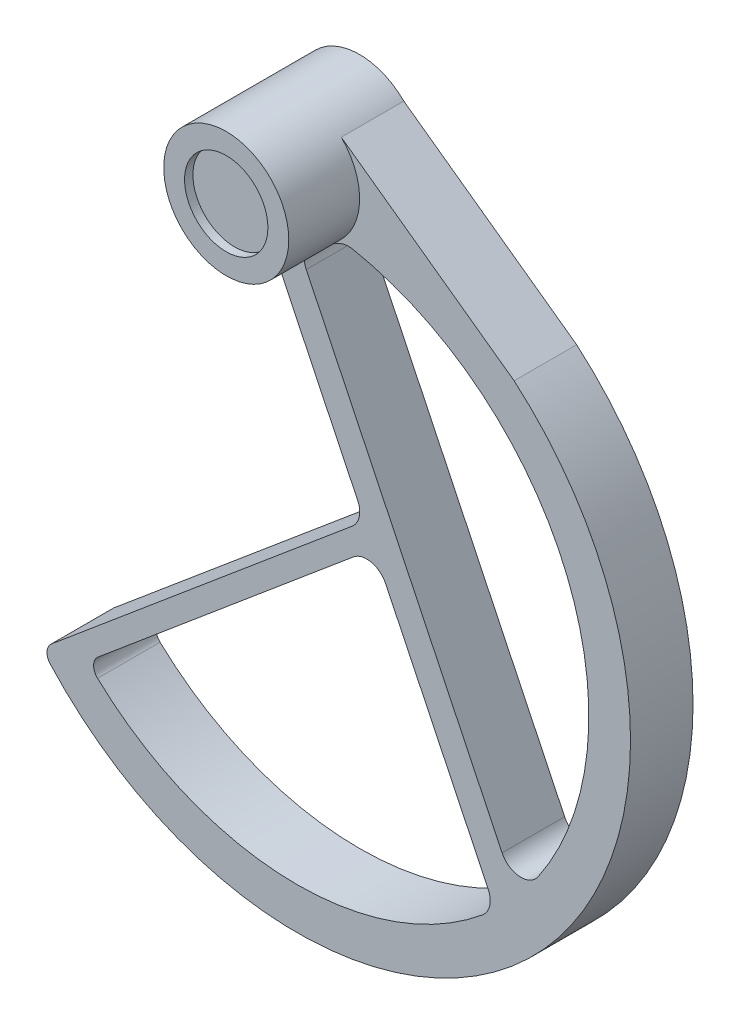
ISO-10303-21;
HEADER;
FILE_DESCRIPTION(('STEP AP214'),'2;1');
FILE_NAME('part.step','',(''),(''),'','','');
FILE_SCHEMA(('AUTOMOTIVE_DESIGN { 1 0 10303 214 1 1 1 1 }'));
ENDSEC;
DATA;
#1=APPLICATION_CONTEXT('core data for automotive mechanical design processes');
#2=APPLICATION_PROTOCOL_DEFINITION('international standard','automotive_design',2000,#1);
#3=PRODUCT_CONTEXT('',#1,'mechanical');
#4=PRODUCT('Part','Part','',(#3));
#5=PRODUCT_RELATED_PRODUCT_CATEGORY('part','',(#4));
#6=PRODUCT_DEFINITION_FORMATION('','',#4);
#7=PRODUCT_DEFINITION_CONTEXT('part definition',#1,'design');
#8=PRODUCT_DEFINITION('design','',#6,#7);
#9=PRODUCT_DEFINITION_SHAPE('','',#8);
#10=(LENGTH_UNIT() NAMED_UNIT(*) SI_UNIT(.MILLI.,.METRE.));
#11=(NAMED_UNIT(*) PLANE_ANGLE_UNIT() SI_UNIT($,.RADIAN.));
#12=(NAMED_UNIT(*) SI_UNIT($,.STERADIAN.) SOLID_ANGLE_UNIT());
#13=UNCERTAINTY_MEASURE_WITH_UNIT(LENGTH_MEASURE(1.E-05),#10,'distance_accuracy_value','');
#14=(GEOMETRIC_REPRESENTATION_CONTEXT(3) GLOBAL_UNCERTAINTY_ASSIGNED_CONTEXT((#13)) GLOBAL_UNIT_ASSIGNED_CONTEXT((#10,
#11,#12)) REPRESENTATION_CONTEXT('',''));
#15=CARTESIAN_POINT('',(0.,0.,0.));
#16=DIRECTION('',(0.,0.,1.));
#17=DIRECTION('',(1.,0.,0.));
#18=AXIS2_PLACEMENT_3D('',#15,#16,#17);
#19=CARTESIAN_POINT('',(-12.7570586950624,-6.1348621133076,15.));
#20=DIRECTION('',(0.901206602628173,0.433389731511241,0.));
#21=DIRECTION('',(-0.433389731511241,0.901206602628173,0.));
#22=AXIS2_PLACEMENT_3D('',#19,#20,#21);
#23=PLANE('',#22);
#24=DIRECTION('',(0.433389731511241,-0.901206602628173,0.));
#25=VECTOR('',#24,1.);
#26=CARTESIAN_POINT('',(-12.7570586950624,-6.1348621133076,0.));
#27=LINE('',#26,#25);
#28=CARTESIAN_POINT('',(21.2324006956412,-76.8137984043253,0.));
#29=VERTEX_POINT('',#28);
#30=CARTESIAN_POINT('',(45.844843506453,-127.9938203457,0.));
#31=VERTEX_POINT('',#30);
#32=EDGE_CURVE('E312',#29,#31,#27,.T.);
#33=ORIENTED_EDGE('',*,*,#32,.T.);
#34=DIRECTION('',(0.,0.,-1.));
#35=VECTOR('',#34,1.);
#36=CARTESIAN_POINT('',(45.844843506453,-127.9938203457,15.));
#37=LINE('',#36,#35);
#38=CARTESIAN_POINT('',(45.844843506453,-127.9938203457,15.));
#39=VERTEX_POINT('',#38);
#40=EDGE_CURVE('E197',#39,#31,#37,.T.);
#41=ORIENTED_EDGE('',*,*,#40,.F.);
#42=DIRECTION('',(0.433389731511241,-0.901206602628173,0.));
#43=VECTOR('',#42,1.);
#44=CARTESIAN_POINT('',(-12.7570586950624,-6.1348621133076,15.));
#45=LINE('',#44,#43);
#46=CARTESIAN_POINT('',(21.2324006956412,-76.8137984043253,15.));
#47=VERTEX_POINT('',#46);
#48=EDGE_CURVE('E280',#47,#39,#45,.T.);
#49=ORIENTED_EDGE('',*,*,#48,.F.);
#50=DIRECTION('',(0.,0.,-1.));
#51=VECTOR('',#50,1.);
#52=CARTESIAN_POINT('',(21.2324006956412,-76.8137984043253,15.));
#53=LINE('',#52,#51);
#54=EDGE_CURVE('E326',#47,#29,#53,.T.);
#55=ORIENTED_EDGE('',*,*,#54,.T.);
#56=EDGE_LOOP('',(#33,#41,#49,#55));
#57=FACE_BOUND('',#56,.T.);
#58=ADVANCED_FACE('F35',(#57),#23,.F.);
#59=CARTESIAN_POINT('',(41.3388104933121,-130.160769003256,15.));
#60=DIRECTION('',(0.,0.,-1.));
#61=DIRECTION('',(-1.,0.,0.));
#62=AXIS2_PLACEMENT_3D('',#59,#60,#61);
#63=CYLINDRICAL_SURFACE('',#62,4.99999999999999);
#64=CARTESIAN_POINT('',(41.3388104933121,-130.160769003256,0.));
#65=DIRECTION('',(0.,0.,1.));
#66=DIRECTION('',(1.,0.,0.));
#67=AXIS2_PLACEMENT_3D('',#64,#65,#66);
#68=CIRCLE('',#67,4.99999999999999);
#69=CARTESIAN_POINT('',(44.5187189927976,-134.019289695814,0.));
#70=VERTEX_POINT('',#69);
#71=EDGE_CURVE('E315',#31,#70,#68,.F.);
#72=ORIENTED_EDGE('',*,*,#71,.T.);
#73=DIRECTION('',(0.,0.,-1.));
#74=VECTOR('',#73,1.);
#75=CARTESIAN_POINT('',(44.5187189927976,-134.019289695814,15.));
#76=LINE('',#75,#74);
#77=CARTESIAN_POINT('',(44.5187189927976,-134.019289695814,15.));
#78=VERTEX_POINT('',#77);
#79=EDGE_CURVE('E200',#78,#70,#76,.T.);
#80=ORIENTED_EDGE('',*,*,#79,.F.);
#81=CARTESIAN_POINT('',(41.3388104933121,-130.160769003256,15.));
#82=DIRECTION('',(0.,0.,1.));
#83=DIRECTION('',(1.,0.,0.));
#84=AXIS2_PLACEMENT_3D('',#81,#82,#83);
#85=CIRCLE('',#84,4.99999999999999);
#86=EDGE_CURVE('E283',#39,#78,#85,.F.);
#87=ORIENTED_EDGE('',*,*,#86,.F.);
#88=ORIENTED_EDGE('',*,*,#40,.T.);
#89=EDGE_LOOP('',(#72,#80,#87,#88));
#90=FACE_BOUND('',#89,.T.);
#91=ADVANCED_FACE('F379',(#90),#63,.F.);
#92=CARTESIAN_POINT('',(0.,-80.,15.));
#93=DIRECTION('',(0.,0.,-1.));
#94=DIRECTION('',(-1.,0.,0.));
#95=AXIS2_PLACEMENT_3D('',#92,#93,#94);
#96=CYLINDRICAL_SURFACE('',#95,70.);
#97=CARTESIAN_POINT('',(0.,-80.,0.));
#98=DIRECTION('',(0.,0.,1.));
#99=DIRECTION('',(1.,0.,0.));
#100=AXIS2_PLACEMENT_3D('',#97,#98,#99);
#101=CIRCLE('',#100,70.);
#102=CARTESIAN_POINT('',(-47.870174388264,-131.072951785042,0.));
#103=VERTEX_POINT('',#102);
#104=EDGE_CURVE('E318',#103,#70,#101,.T.);
#105=ORIENTED_EDGE('',*,*,#104,.F.);
#106=DIRECTION('',(0.,0.,-1.));
#107=VECTOR('',#106,1.);
#108=CARTESIAN_POINT('',(-47.870174388264,-131.072951785042,15.));
#109=LINE('',#108,#107);
#110=CARTESIAN_POINT('',(-47.870174388264,-131.072951785042,15.));
#111=VERTEX_POINT('',#110);
#112=EDGE_CURVE('E335',#111,#103,#109,.T.);
#113=ORIENTED_EDGE('',*,*,#112,.F.);
#114=CARTESIAN_POINT('',(0.,-80.,15.));
#115=DIRECTION('',(0.,0.,1.));
#116=DIRECTION('',(1.,0.,0.));
#117=AXIS2_PLACEMENT_3D('',#114,#115,#116);
#118=CIRCLE('',#117,70.);
#119=EDGE_CURVE('E285',#111,#78,#118,.T.);
#120=ORIENTED_EDGE('',*,*,#119,.T.);
#121=ORIENTED_EDGE('',*,*,#79,.T.);
#122=EDGE_LOOP('',(#105,#113,#120,#121));
#123=FACE_BOUND('',#122,.T.);
#124=ADVANCED_FACE('F384',(#123),#96,.F.);
#125=CARTESIAN_POINT('',(-45.8185954859101,-128.884110994254,15.));
#126=DIRECTION('',(0.,0.,-1.));
#127=DIRECTION('',(-1.,0.,0.));
#128=AXIS2_PLACEMENT_3D('',#125,#126,#127);
#129=CYLINDRICAL_SURFACE('',#128,2.99999999999979);
#130=CARTESIAN_POINT('',(-45.8185954859101,-128.884110994254,0.));
#131=DIRECTION('',(0.,0.,1.));
#132=DIRECTION('',(1.,0.,0.));
#133=AXIS2_PLACEMENT_3D('',#130,#131,#132);
#134=CIRCLE('',#133,2.99999999999979);
#135=CARTESIAN_POINT('',(-47.7476784165524,-126.586582094174,0.));
#136=VERTEX_POINT('',#135);
#137=EDGE_CURVE('E321',#103,#136,#134,.F.);
#138=ORIENTED_EDGE('',*,*,#137,.T.);
#139=DIRECTION('',(0.,0.,-1.));
#140=VECTOR('',#139,1.);
#141=CARTESIAN_POINT('',(-47.7476784165524,-126.586582094174,15.));
#142=LINE('',#141,#140);
#143=CARTESIAN_POINT('',(-47.7476784165524,-126.586582094174,15.));
#144=VERTEX_POINT('',#143);
#145=EDGE_CURVE('E332',#144,#136,#142,.T.);
#146=ORIENTED_EDGE('',*,*,#145,.F.);
#147=CARTESIAN_POINT('',(-45.8185954859101,-128.884110994254,15.));
#148=DIRECTION('',(0.,0.,1.));
#149=DIRECTION('',(1.,0.,0.));
#150=AXIS2_PLACEMENT_3D('',#147,#148,#149);
#151=CIRCLE('',#150,2.99999999999979);
#152=EDGE_CURVE('E288',#111,#144,#151,.F.);
#153=ORIENTED_EDGE('',*,*,#152,.F.);
#154=ORIENTED_EDGE('',*,*,#112,.T.);
#155=EDGE_LOOP('',(#138,#146,#153,#154));
#156=FACE_BOUND('',#155,.T.);
#157=ADVANCED_FACE('F390',(#156),#129,.F.);
#158=CARTESIAN_POINT('',(42.5956727933285,-50.7312504333006,15.));
#159=DIRECTION('',(-0.643027643547508,0.765842966693394,0.));
#160=DIRECTION('',(-0.765842966693394,-0.643027643547508,0.));
#161=AXIS2_PLACEMENT_3D('',#158,#159,#160);
#162=PLANE('',#161);
#163=DIRECTION('',(0.765842966693394,0.643027643547508,0.));
#164=VECTOR('',#163,1.);
#165=CARTESIAN_POINT('',(42.5956727933285,-50.7312504333006,0.));
#166=LINE('',#165,#164);
#167=CARTESIAN_POINT('',(13.5112294647628,-75.1515322284145,0.));
#168=VERTEX_POINT('',#167);
#169=EDGE_CURVE('E323',#136,#168,#166,.T.);
#170=ORIENTED_EDGE('',*,*,#169,.T.);
#171=DIRECTION('',(0.,0.,-1.));
#172=VECTOR('',#171,1.);
#173=CARTESIAN_POINT('',(13.5112294647628,-75.1515322284145,15.));
#174=LINE('',#173,#172);
#175=CARTESIAN_POINT('',(13.5112294647628,-75.1515322284145,15.));
#176=VERTEX_POINT('',#175);
#177=EDGE_CURVE('E329',#176,#168,#174,.T.);
#178=ORIENTED_EDGE('',*,*,#177,.F.);
#179=DIRECTION('',(0.765842966693394,0.643027643547508,0.));
#180=VECTOR('',#179,1.);
#181=CARTESIAN_POINT('',(42.5956727933285,-50.7312504333006,15.));
#182=LINE('',#181,#180);
#183=EDGE_CURVE('E290',#144,#176,#182,.T.);
#184=ORIENTED_EDGE('',*,*,#183,.F.);
#185=ORIENTED_EDGE('',*,*,#145,.T.);
#186=EDGE_LOOP('',(#170,#178,#184,#185));
#187=FACE_BOUND('',#186,.T.);
#188=ADVANCED_FACE('F394',(#187),#162,.F.);
#189=CARTESIAN_POINT('',(10.0302471408598,-65.0565868768263,15.));
#190=DIRECTION('',(0.,0.,-1.));
#191=DIRECTION('',(-1.,0.,0.));
#192=AXIS2_PLACEMENT_3D('',#189,#190,#191);
#193=CYLINDRICAL_SURFACE('',#192,5.);
#194=CARTESIAN_POINT('',(10.0302471408598,-65.0565868768263,0.));
#195=DIRECTION('',(0.,0.,1.));
#196=DIRECTION('',(1.,0.,0.));
#197=AXIS2_PLACEMENT_3D('',#194,#195,#196);
#198=CIRCLE('',#197,5.);
#199=CARTESIAN_POINT('',(13.2441851892925,-68.8868090924212,0.));
#200=VERTEX_POINT('',#199);
#201=CARTESIAN_POINT('',(14.5362801540007,-62.8896382192701,0.));
#202=VERTEX_POINT('',#201);
#203=EDGE_CURVE('E258',#200,#202,#198,.T.);
#204=ORIENTED_EDGE('',*,*,#203,.F.);
#205=DIRECTION('',(0.,0.,-1.));
#206=VECTOR('',#205,1.);
#207=CARTESIAN_POINT('',(13.2441851892925,-68.8868090924212,15.));
#208=LINE('',#207,#206);
#209=CARTESIAN_POINT('',(13.2441851892925,-68.8868090924212,15.));
#210=VERTEX_POINT('',#209);
#211=EDGE_CURVE('E208',#210,#200,#208,.T.);
#212=ORIENTED_EDGE('',*,*,#211,.F.);
#213=CARTESIAN_POINT('',(10.0302471408598,-65.0565868768263,15.));
#214=DIRECTION('',(0.,0.,1.));
#215=DIRECTION('',(1.,0.,0.));
#216=AXIS2_PLACEMENT_3D('',#213,#214,#215);
#217=CIRCLE('',#216,5.);
#218=CARTESIAN_POINT('',(14.5362801540007,-62.8896382192701,15.));
#219=VERTEX_POINT('',#218);
#220=EDGE_CURVE('E269',#210,#219,#217,.T.);
#221=ORIENTED_EDGE('',*,*,#220,.T.);
#222=DIRECTION('',(0.,0.,-1.));
#223=VECTOR('',#222,1.);
#224=CARTESIAN_POINT('',(14.5362801540007,-62.8896382192701,15.));
#225=LINE('',#224,#223);
#226=EDGE_CURVE('E294',#219,#202,#225,.T.);
#227=ORIENTED_EDGE('',*,*,#226,.T.);
#228=EDGE_LOOP('',(#204,#212,#221,#227));
#229=FACE_BOUND('',#228,.T.);
#230=ADVANCED_FACE('F37',(#229),#193,.F.);
#231=CARTESIAN_POINT('',(39.3923101204882,-46.9459271066778,15.));
#232=DIRECTION('',(-0.642787609686534,0.766044443118983,0.));
#233=DIRECTION('',(-0.766044443118982,-0.642787609686534,0.));
#234=AXIS2_PLACEMENT_3D('',#231,#232,#233);
#235=PLANE('',#234);
#236=DIRECTION('',(0.766044443118982,0.642787609686534,0.));
#237=VECTOR('',#236,1.);
#238=CARTESIAN_POINT('',(39.3923101204882,-46.9459271066778,0.));
#239=LINE('',#238,#237);
#240=CARTESIAN_POINT('',(-58.9406362868111,-129.457066169617,0.));
#241=VERTEX_POINT('',#240);
#242=EDGE_CURVE('E297',#241,#200,#239,.T.);
#243=ORIENTED_EDGE('',*,*,#242,.F.);
#244=DIRECTION('',(0.,0.,-1.));
#245=VECTOR('',#244,1.);
#246=CARTESIAN_POINT('',(-58.9406362868111,-129.457066169617,15.));
#247=LINE('',#246,#245);
#248=CARTESIAN_POINT('',(-58.9406362868111,-129.457066169617,15.));
#249=VERTEX_POINT('',#248);
#250=EDGE_CURVE('E341',#249,#241,#247,.T.);
#251=ORIENTED_EDGE('',*,*,#250,.F.);
#252=DIRECTION('',(0.766044443118982,0.642787609686534,0.));
#253=VECTOR('',#252,1.);
#254=CARTESIAN_POINT('',(39.3923101204882,-46.9459271066778,15.));
#255=LINE('',#254,#253);
#256=EDGE_CURVE('E272',#249,#210,#255,.T.);
#257=ORIENTED_EDGE('',*,*,#256,.T.);
#258=ORIENTED_EDGE('',*,*,#211,.T.);
#259=EDGE_LOOP('',(#243,#251,#257,#258));
#260=FACE_BOUND('',#259,.T.);
#261=ADVANCED_FACE('F347',(#260),#235,.T.);
#262=CARTESIAN_POINT('',(-57.0122734577518,-131.755199498973,15.));
#263=DIRECTION('',(0.,0.,-1.));
#264=DIRECTION('',(-1.,0.,0.));
#265=AXIS2_PLACEMENT_3D('',#262,#263,#264);
#266=CYLINDRICAL_SURFACE('',#265,2.99999999999976);
#267=CARTESIAN_POINT('',(-57.0122734577518,-131.755199498973,0.));
#268=DIRECTION('',(0.,0.,1.));
#269=DIRECTION('',(1.,0.,0.));
#270=AXIS2_PLACEMENT_3D('',#267,#268,#269);
#271=CIRCLE('',#270,2.99999999999976);
#272=CARTESIAN_POINT('',(-59.2335308651964,-133.771635843089,0.));
#273=VERTEX_POINT('',#272);
#274=EDGE_CURVE('E300',#273,#241,#271,.F.);
#275=ORIENTED_EDGE('',*,*,#274,.F.);
#276=DIRECTION('',(0.,0.,-1.));
#277=VECTOR('',#276,1.);
#278=CARTESIAN_POINT('',(-59.2335308651964,-133.771635843089,15.));
#279=LINE('',#278,#277);
#280=CARTESIAN_POINT('',(-59.2335308651964,-133.771635843089,15.));
#281=VERTEX_POINT('',#280);
#282=EDGE_CURVE('E340',#281,#273,#279,.T.);
#283=ORIENTED_EDGE('',*,*,#282,.F.);
#284=CARTESIAN_POINT('',(-57.0122734577518,-131.755199498973,15.));
#285=DIRECTION('',(0.,0.,1.));
#286=DIRECTION('',(1.,0.,0.));
#287=AXIS2_PLACEMENT_3D('',#284,#285,#286);
#288=CIRCLE('',#287,2.99999999999976);
#289=EDGE_CURVE('E276',#281,#249,#288,.F.);
#290=ORIENTED_EDGE('',*,*,#289,.T.);
#291=ORIENTED_EDGE('',*,*,#250,.T.);
#292=EDGE_LOOP('',(#275,#283,#290,#291));
#293=FACE_BOUND('',#292,.T.);
#294=ADVANCED_FACE('F357',(#293),#266,.T.);
#295=CARTESIAN_POINT('',(0.,-80.,15.));
#296=DIRECTION('',(0.,0.,-1.));
#297=DIRECTION('',(-1.,0.,0.));
#298=AXIS2_PLACEMENT_3D('',#295,#296,#297);
#299=CYLINDRICAL_SURFACE('',#298,80.);
#300=CARTESIAN_POINT('',(0.,-80.,0.));
#301=DIRECTION('',(0.,0.,1.));
#302=DIRECTION('',(1.,0.,0.));
#303=AXIS2_PLACEMENT_3D('',#300,#301,#302);
#304=CIRCLE('',#303,80.);
#305=CARTESIAN_POINT('',(52.0761789176773,-19.2705047828153,0.));
#306=VERTEX_POINT('',#305);
#307=EDGE_CURVE('E303',#273,#306,#304,.T.);
#308=ORIENTED_EDGE('',*,*,#307,.T.);
#309=DIRECTION('',(0.,0.,-1.));
#310=VECTOR('',#309,1.);
#311=CARTESIAN_POINT('',(52.0761789176773,-19.2705047828153,15.));
#312=LINE('',#311,#310);
#313=CARTESIAN_POINT('',(52.0761789176773,-19.2705047828153,15.));
#314=VERTEX_POINT('',#313);
#315=EDGE_CURVE('E189',#314,#306,#312,.T.);
#316=ORIENTED_EDGE('',*,*,#315,.F.);
#317=CARTESIAN_POINT('',(0.,-80.,15.));
#318=DIRECTION('',(0.,0.,1.));
#319=DIRECTION('',(1.,0.,0.));
#320=AXIS2_PLACEMENT_3D('',#317,#318,#319);
#321=CIRCLE('',#320,80.);
#322=EDGE_CURVE('E177',#281,#314,#321,.T.);
#323=ORIENTED_EDGE('',*,*,#322,.F.);
#324=ORIENTED_EDGE('',*,*,#282,.T.);
#325=EDGE_LOOP('',(#308,#316,#323,#324));
#326=FACE_BOUND('',#325,.T.);
#327=ADVANCED_FACE('F359',(#326),#299,.T.);
#328=CARTESIAN_POINT('',(8.65474635415258,12.0128323695446,15.));
#329=DIRECTION('',(0.584549661802916,0.811357931424902,0.));
#330=DIRECTION('',(-0.811357931424902,0.584549661802916,0.));
#331=AXIS2_PLACEMENT_3D('',#328,#329,#330);
#332=PLANE('',#331);
#333=DIRECTION('',(0.811357931424902,-0.584549661802916,0.));
#334=VECTOR('',#333,1.);
#335=CARTESIAN_POINT('',(8.65474635415258,12.0128323695446,0.));
#336=LINE('',#335,#334);
#337=CARTESIAN_POINT('',(10.6066017177981,10.6066017177983,0.));
#338=VERTEX_POINT('',#337);
#339=EDGE_CURVE('E186',#338,#306,#336,.T.);
#340=ORIENTED_EDGE('',*,*,#339,.F.);
#341=DIRECTION('',(0.,0.,-1.));
#342=VECTOR('',#341,1.);
#343=CARTESIAN_POINT('',(10.6066017177981,10.6066017177983,15.));
#344=LINE('',#343,#342);
#345=CARTESIAN_POINT('',(10.6066017177981,10.6066017177983,15.));
#346=VERTEX_POINT('',#345);
#347=EDGE_CURVE('E183',#346,#338,#344,.T.);
#348=ORIENTED_EDGE('',*,*,#347,.F.);
#349=DIRECTION('',(0.811357931424902,-0.584549661802916,0.));
#350=VECTOR('',#349,1.);
#351=CARTESIAN_POINT('',(8.65474635415258,12.0128323695446,15.));
#352=LINE('',#351,#350);
#353=EDGE_CURVE('E171',#346,#314,#352,.T.);
#354=ORIENTED_EDGE('',*,*,#353,.T.);
#355=ORIENTED_EDGE('',*,*,#315,.T.);
#356=EDGE_LOOP('',(#340,#348,#354,#355));
#357=FACE_BOUND('',#356,.T.);
#358=ADVANCED_FACE('F184',(#357),#332,.T.);
#359=CARTESIAN_POINT('',(0.,0.,15.));
#360=DIRECTION('',(0.,0.,-1.));
#361=DIRECTION('',(-1.,0.,0.));
#362=AXIS2_PLACEMENT_3D('',#359,#360,#361);
#363=CYLINDRICAL_SURFACE('',#362,15.);
#364=CARTESIAN_POINT('',(0.,0.,0.));
#365=DIRECTION('',(0.,0.,1.));
#366=DIRECTION('',(1.,0.,0.));
#367=AXIS2_PLACEMENT_3D('',#364,#365,#366);
#368=CIRCLE('',#367,15.);
#369=CARTESIAN_POINT('',(-10.6066017177981,-10.6066017177983,0.));
#370=VERTEX_POINT('',#369);
#371=EDGE_CURVE('E307',#338,#370,#368,.T.);
#372=ORIENTED_EDGE('',*,*,#371,.T.);
#373=DIRECTION('',(0.,0.,-1.));
#374=VECTOR('',#373,1.);
#375=CARTESIAN_POINT('',(-10.6066017177981,-10.6066017177983,15.));
#376=LINE('',#375,#374);
#377=CARTESIAN_POINT('',(-10.6066017177981,-10.6066017177983,15.));
#378=VERTEX_POINT('',#377);
#379=EDGE_CURVE('E190',#378,#370,#376,.T.);
#380=ORIENTED_EDGE('',*,*,#379,.F.);
#381=CARTESIAN_POINT('',(0.,0.,15.));
#382=DIRECTION('',(0.,0.,1.));
#383=DIRECTION('',(1.,0.,0.));
#384=AXIS2_PLACEMENT_3D('',#381,#382,#383);
#385=CIRCLE('',#384,15.);
#386=CARTESIAN_POINT('',(5.49416198956529,-13.9575851791209,15.));
#387=VERTEX_POINT('',#386);
#388=EDGE_CURVE('E11',#378,#387,#385,.T.);
#389=ORIENTED_EDGE('',*,*,#388,.T.);
#390=CARTESIAN_POINT('',(7.47266922099551,-13.0061222012399,15.));
#391=VERTEX_POINT('',#390);
#392=EDGE_CURVE('E196',#387,#391,#385,.T.);
#393=ORIENTED_EDGE('',*,*,#392,.T.);
#394=EDGE_CURVE('E44',#391,#346,#385,.T.);
#395=ORIENTED_EDGE('',*,*,#394,.T.);
#396=ORIENTED_EDGE('',*,*,#347,.T.);
#397=EDGE_LOOP('',(#372,#380,#389,#393,#395,#396));
#398=FACE_BOUND('',#397,.T.);
#399=CARTESIAN_POINT('',(0.,0.,32.));
#400=DIRECTION('',(0.,0.,1.));
#401=DIRECTION('',(1.,0.,0.));
#402=AXIS2_PLACEMENT_3D('',#399,#400,#401);
#403=CIRCLE('',#402,15.);
#404=CARTESIAN_POINT('',(15.,0.,32.));
#405=VERTEX_POINT('',#404);
#406=EDGE_CURVE('E216',#405,#405,#403,.T.);
#407=ORIENTED_EDGE('',*,*,#406,.F.);
#408=EDGE_LOOP('',(#407));
#409=FACE_BOUND('',#408,.T.);
#410=ADVANCED_FACE('F193',(#398,#409),#363,.T.);
#411=CARTESIAN_POINT('',(-12.7570586950624,-6.13486211330761,15.));
#412=DIRECTION('',(0.901206602628173,0.433389731511242,0.));
#413=DIRECTION('',(-0.433389731511242,0.901206602628173,0.));
#414=AXIS2_PLACEMENT_3D('',#411,#412,#413);
#415=PLANE('',#414);
#416=DIRECTION('',(0.433389731511242,-0.901206602628173,0.));
#417=VECTOR('',#416,1.);
#418=CARTESIAN_POINT('',(-12.7570586950624,-6.13486211330761,0.));
#419=LINE('',#418,#417);
#420=EDGE_CURVE('E309',#370,#202,#419,.T.);
#421=ORIENTED_EDGE('',*,*,#420,.T.);
#422=ORIENTED_EDGE('',*,*,#226,.F.);
#423=DIRECTION('',(0.433389731511242,-0.901206602628173,0.));
#424=VECTOR('',#423,1.);
#425=CARTESIAN_POINT('',(-12.7570586950624,-6.13486211330761,15.));
#426=LINE('',#425,#424);
#427=EDGE_CURVE('E180',#378,#219,#426,.T.);
#428=ORIENTED_EDGE('',*,*,#427,.F.);
#429=ORIENTED_EDGE('',*,*,#379,.T.);
#430=EDGE_LOOP('',(#421,#422,#428,#429));
#431=FACE_BOUND('',#430,.T.);
#432=ADVANCED_FACE('F364',(#431),#415,.F.);
#433=CARTESIAN_POINT('',(16.7263676825004,-78.9807470618814,15.));
#434=DIRECTION('',(0.,0.,-1.));
#435=DIRECTION('',(-1.,0.,0.));
#436=AXIS2_PLACEMENT_3D('',#433,#434,#435);
#437=CYLINDRICAL_SURFACE('',#436,5.);
#438=CARTESIAN_POINT('',(16.7263676825004,-78.9807470618814,0.));
#439=DIRECTION('',(0.,0.,1.));
#440=DIRECTION('',(1.,0.,0.));
#441=AXIS2_PLACEMENT_3D('',#438,#439,#440);
#442=CIRCLE('',#441,5.);
#443=EDGE_CURVE('E273',#168,#29,#442,.F.);
#444=ORIENTED_EDGE('',*,*,#443,.T.);
#445=ORIENTED_EDGE('',*,*,#54,.F.);
#446=CARTESIAN_POINT('',(16.7263676825004,-78.9807470618814,15.));
#447=DIRECTION('',(0.,0.,1.));
#448=DIRECTION('',(1.,0.,0.));
#449=AXIS2_PLACEMENT_3D('',#446,#447,#448);
#450=CIRCLE('',#449,5.);
#451=EDGE_CURVE('E292',#176,#47,#450,.F.);
#452=ORIENTED_EDGE('',*,*,#451,.F.);
#453=ORIENTED_EDGE('',*,*,#177,.T.);
#454=EDGE_LOOP('',(#444,#445,#452,#453));
#455=FACE_BOUND('',#454,.T.);
#456=ADVANCED_FACE('F368',(#455),#437,.F.);
#457=CARTESIAN_POINT('',(0.,0.,15.));
#458=DIRECTION('',(0.,0.,1.));
#459=DIRECTION('',(1.,0.,0.));
#460=AXIS2_PLACEMENT_3D('',#457,#458,#459);
#461=PLANE('',#460);
#462=ORIENTED_EDGE('',*,*,#388,.F.);
#463=ORIENTED_EDGE('',*,*,#427,.T.);
#464=ORIENTED_EDGE('',*,*,#220,.F.);
#465=ORIENTED_EDGE('',*,*,#256,.F.);
#466=ORIENTED_EDGE('',*,*,#289,.F.);
#467=ORIENTED_EDGE('',*,*,#322,.T.);
#468=ORIENTED_EDGE('',*,*,#353,.F.);
#469=ORIENTED_EDGE('',*,*,#394,.F.);
#470=DIRECTION('',(-0.901206602628171,-0.433389731511247,0.));
#471=VECTOR('',#470,1.);
#472=CARTESIAN_POINT('',(6.4834156052804,-13.4818536901804,15.));
#473=LINE('',#472,#471);
#474=CARTESIAN_POINT('',(10.2196588467731,-11.6850964864837,15.));
#475=VERTEX_POINT('',#474);
#476=EDGE_CURVE('E223',#475,#391,#473,.T.);
#477=ORIENTED_EDGE('',*,*,#476,.F.);
#478=CARTESIAN_POINT('',(12.3866075043293,-16.1911294996245,15.));
#479=DIRECTION('',(0.,0.,1.));
#480=DIRECTION('',(1.,0.,0.));
#481=AXIS2_PLACEMENT_3D('',#478,#479,#480);
#482=CIRCLE('',#481,5.);
#483=CARTESIAN_POINT('',(13.3394234662008,-11.2827548457495,15.));
#484=VERTEX_POINT('',#483);
#485=EDGE_CURVE('E250',#484,#475,#482,.T.);
#486=ORIENTED_EDGE('',*,*,#485,.F.);
#487=CARTESIAN_POINT('',(0.,-80.,15.));
#488=DIRECTION('',(0.,0.,1.));
#489=DIRECTION('',(1.,0.,0.));
#490=AXIS2_PLACEMENT_3D('',#487,#488,#489);
#491=CIRCLE('',#490,69.9999999999999);
#492=CARTESIAN_POINT('',(57.8260553336624,-119.448033215209,15.));
#493=VERTEX_POINT('',#492);
#494=EDGE_CURVE('E247',#493,#484,#491,.T.);
#495=ORIENTED_EDGE('',*,*,#494,.F.);
#496=CARTESIAN_POINT('',(53.6956228098294,-116.63031655698,15.));
#497=DIRECTION('',(0.,0.,1.));
#498=DIRECTION('',(-1.,0.,0.));
#499=AXIS2_PLACEMENT_3D('',#496,#497,#498);
#500=CIRCLE('',#499,5.);
#501=CARTESIAN_POINT('',(49.1895897966885,-118.797265214536,15.));
#502=VERTEX_POINT('',#501);
#503=EDGE_CURVE('E244',#502,#493,#500,.T.);
#504=ORIENTED_EDGE('',*,*,#503,.F.);
#505=DIRECTION('',(0.433389731511244,-0.901206602628172,0.));
#506=VECTOR('',#505,1.);
#507=CARTESIAN_POINT('',(49.1895897966885,-118.797265214536,15.));
#508=LINE('',#507,#506);
#509=CARTESIAN_POINT('',(2.20175178617109,-21.0890206960504,15.));
#510=VERTEX_POINT('',#509);
#511=EDGE_CURVE('E241',#510,#502,#508,.T.);
#512=ORIENTED_EDGE('',*,*,#511,.F.);
#513=CARTESIAN_POINT('',(6.70778479931193,-18.9220720384942,15.));
#514=DIRECTION('',(0.,0.,1.));
#515=DIRECTION('',(-1.,0.,0.));
#516=AXIS2_PLACEMENT_3D('',#513,#514,#515);
#517=CIRCLE('',#516,5.);
#518=CARTESIAN_POINT('',(4.54083614175573,-14.4160390253533,15.));
#519=VERTEX_POINT('',#518);
#520=EDGE_CURVE('E239',#519,#510,#517,.T.);
#521=ORIENTED_EDGE('',*,*,#520,.F.);
#522=EDGE_CURVE('E52',#387,#519,#473,.T.);
#523=ORIENTED_EDGE('',*,*,#522,.F.);
#524=EDGE_LOOP('',(#462,#463,#464,#465,#466,#467,#468,#469,#477,#486,#495,#504,#512,#521,#523));
#525=FACE_BOUND('',#524,.T.);
#526=ORIENTED_EDGE('',*,*,#48,.T.);
#527=ORIENTED_EDGE('',*,*,#86,.T.);
#528=ORIENTED_EDGE('',*,*,#119,.F.);
#529=ORIENTED_EDGE('',*,*,#152,.T.);
#530=ORIENTED_EDGE('',*,*,#183,.T.);
#531=ORIENTED_EDGE('',*,*,#451,.T.);
#532=EDGE_LOOP('',(#526,#527,#528,#529,#530,#531));
#533=FACE_BOUND('',#532,.T.);
#534=ADVANCED_FACE('F173',(#525,#533),#461,.T.);
#535=CARTESIAN_POINT('',(0.,0.,0.));
#536=DIRECTION('',(0.,0.,1.));
#537=DIRECTION('',(1.,0.,0.));
#538=AXIS2_PLACEMENT_3D('',#535,#536,#537);
#539=PLANE('',#538);
#540=DIRECTION('',(-0.90120660262817,-0.433389731511248,0.));
#541=VECTOR('',#540,1.);
#542=CARTESIAN_POINT('',(6.4834156052804,-13.4818536901804,0.));
#543=LINE('',#542,#541);
#544=CARTESIAN_POINT('',(10.2196588467731,-11.6850964864837,0.));
#545=VERTEX_POINT('',#544);
#546=CARTESIAN_POINT('',(4.54083614175573,-14.4160390253533,0.));
#547=VERTEX_POINT('',#546);
#548=EDGE_CURVE('E235',#545,#547,#543,.T.);
#549=ORIENTED_EDGE('',*,*,#548,.T.);
#550=CARTESIAN_POINT('',(6.70778479931193,-18.9220720384942,0.));
#551=DIRECTION('',(0.,0.,1.));
#552=DIRECTION('',(-1.,0.,0.));
#553=AXIS2_PLACEMENT_3D('',#550,#551,#552);
#554=CIRCLE('',#553,5.);
#555=CARTESIAN_POINT('',(2.20175178617109,-21.0890206960504,0.));
#556=VERTEX_POINT('',#555);
#557=EDGE_CURVE('E219',#547,#556,#554,.T.);
#558=ORIENTED_EDGE('',*,*,#557,.T.);
#559=DIRECTION('',(0.433389731511244,-0.901206602628172,0.));
#560=VECTOR('',#559,1.);
#561=CARTESIAN_POINT('',(49.1895897966885,-118.797265214536,0.));
#562=LINE('',#561,#560);
#563=CARTESIAN_POINT('',(49.1895897966885,-118.797265214536,0.));
#564=VERTEX_POINT('',#563);
#565=EDGE_CURVE('E222',#556,#564,#562,.T.);
#566=ORIENTED_EDGE('',*,*,#565,.T.);
#567=CARTESIAN_POINT('',(53.6956228098294,-116.63031655698,0.));
#568=DIRECTION('',(0.,0.,1.));
#569=DIRECTION('',(-1.,0.,0.));
#570=AXIS2_PLACEMENT_3D('',#567,#568,#569);
#571=CIRCLE('',#570,5.);
#572=CARTESIAN_POINT('',(57.8260553336624,-119.448033215209,0.));
#573=VERTEX_POINT('',#572);
#574=EDGE_CURVE('E226',#564,#573,#571,.T.);
#575=ORIENTED_EDGE('',*,*,#574,.T.);
#576=CARTESIAN_POINT('',(0.,-80.,0.));
#577=DIRECTION('',(0.,0.,1.));
#578=DIRECTION('',(1.,0.,0.));
#579=AXIS2_PLACEMENT_3D('',#576,#577,#578);
#580=CIRCLE('',#579,69.9999999999999);
#581=CARTESIAN_POINT('',(13.3394234662008,-11.2827548457495,0.));
#582=VERTEX_POINT('',#581);
#583=EDGE_CURVE('E229',#573,#582,#580,.T.);
#584=ORIENTED_EDGE('',*,*,#583,.T.);
#585=CARTESIAN_POINT('',(12.3866075043293,-16.1911294996245,0.));
#586=DIRECTION('',(0.,0.,1.));
#587=DIRECTION('',(1.,0.,0.));
#588=AXIS2_PLACEMENT_3D('',#585,#586,#587);
#589=CIRCLE('',#588,5.);
#590=EDGE_CURVE('E232',#582,#545,#589,.T.);
#591=ORIENTED_EDGE('',*,*,#590,.T.);
#592=EDGE_LOOP('',(#549,#558,#566,#575,#584,#591));
#593=FACE_BOUND('',#592,.T.);
#594=ORIENTED_EDGE('',*,*,#203,.T.);
#595=ORIENTED_EDGE('',*,*,#420,.F.);
#596=ORIENTED_EDGE('',*,*,#371,.F.);
#597=ORIENTED_EDGE('',*,*,#339,.T.);
#598=ORIENTED_EDGE('',*,*,#307,.F.);
#599=ORIENTED_EDGE('',*,*,#274,.T.);
#600=ORIENTED_EDGE('',*,*,#242,.T.);
#601=EDGE_LOOP('',(#594,#595,#596,#597,#598,#599,#600));
#602=FACE_BOUND('',#601,.T.);
#603=ORIENTED_EDGE('',*,*,#32,.F.);
#604=ORIENTED_EDGE('',*,*,#443,.F.);
#605=ORIENTED_EDGE('',*,*,#169,.F.);
#606=ORIENTED_EDGE('',*,*,#137,.F.);
#607=ORIENTED_EDGE('',*,*,#104,.T.);
#608=ORIENTED_EDGE('',*,*,#71,.F.);
#609=EDGE_LOOP('',(#603,#604,#605,#606,#607,#608));
#610=FACE_BOUND('',#609,.T.);
#611=ADVANCED_FACE('F354',(#593,#602,#610),#539,.F.);
#612=CARTESIAN_POINT('',(6.70778479931193,-18.9220720384942,0.));
#613=DIRECTION('',(0.,0.,1.));
#614=DIRECTION('',(1.,0.,0.));
#615=AXIS2_PLACEMENT_3D('',#612,#613,#614);
#616=CYLINDRICAL_SURFACE('',#615,5.);
#617=ORIENTED_EDGE('',*,*,#520,.T.);
#618=DIRECTION('',(0.,0.,1.));
#619=VECTOR('',#618,1.);
#620=CARTESIAN_POINT('',(2.20175178617109,-21.0890206960504,0.));
#621=LINE('',#620,#619);
#622=EDGE_CURVE('E238',#556,#510,#621,.T.);
#623=ORIENTED_EDGE('',*,*,#622,.F.);
#624=ORIENTED_EDGE('',*,*,#557,.F.);
#625=DIRECTION('',(0.,0.,1.));
#626=VECTOR('',#625,1.);
#627=CARTESIAN_POINT('',(4.54083614175573,-14.4160390253533,0.));
#628=LINE('',#627,#626);
#629=EDGE_CURVE('E255',#547,#519,#628,.T.);
#630=ORIENTED_EDGE('',*,*,#629,.T.);
#631=EDGE_LOOP('',(#617,#623,#624,#630));
#632=FACE_BOUND('',#631,.T.);
#633=ADVANCED_FACE('F401',(#632),#616,.F.);
#634=CARTESIAN_POINT('',(6.4834156052804,-13.4818536901804,0.));
#635=DIRECTION('',(-0.433389731511247,0.901206602628171,0.));
#636=DIRECTION('',(-0.901206602628171,-0.433389731511247,0.));
#637=AXIS2_PLACEMENT_3D('',#634,#635,#636);
#638=PLANE('',#637);
#639=ORIENTED_EDGE('',*,*,#476,.T.);
#640=EDGE_CURVE('E254',#391,#387,#473,.T.);
#641=ORIENTED_EDGE('',*,*,#640,.T.);
#642=ORIENTED_EDGE('',*,*,#522,.T.);
#643=ORIENTED_EDGE('',*,*,#629,.F.);
#644=ORIENTED_EDGE('',*,*,#548,.F.);
#645=DIRECTION('',(0.,0.,1.));
#646=VECTOR('',#645,1.);
#647=CARTESIAN_POINT('',(10.2196588467731,-11.6850964864837,0.));
#648=LINE('',#647,#646);
#649=EDGE_CURVE('E259',#545,#475,#648,.T.);
#650=ORIENTED_EDGE('',*,*,#649,.T.);
#651=EDGE_LOOP('',(#639,#641,#642,#643,#644,#650));
#652=FACE_BOUND('',#651,.T.);
#653=ADVANCED_FACE('F407',(#652),#638,.F.);
#654=CARTESIAN_POINT('',(12.3866075043293,-16.1911294996245,0.));
#655=DIRECTION('',(0.,0.,1.));
#656=DIRECTION('',(1.,0.,0.));
#657=AXIS2_PLACEMENT_3D('',#654,#655,#656);
#658=CYLINDRICAL_SURFACE('',#657,5.);
#659=ORIENTED_EDGE('',*,*,#485,.T.);
#660=ORIENTED_EDGE('',*,*,#649,.F.);
#661=ORIENTED_EDGE('',*,*,#590,.F.);
#662=DIRECTION('',(0.,0.,1.));
#663=VECTOR('',#662,1.);
#664=CARTESIAN_POINT('',(13.3394234662008,-11.2827548457495,0.));
#665=LINE('',#664,#663);
#666=EDGE_CURVE('E261',#582,#484,#665,.T.);
#667=ORIENTED_EDGE('',*,*,#666,.T.);
#668=EDGE_LOOP('',(#659,#660,#661,#667));
#669=FACE_BOUND('',#668,.T.);
#670=ADVANCED_FACE('F421',(#669),#658,.F.);
#671=CARTESIAN_POINT('',(0.,-80.,0.));
#672=DIRECTION('',(0.,0.,1.));
#673=DIRECTION('',(1.,0.,0.));
#674=AXIS2_PLACEMENT_3D('',#671,#672,#673);
#675=CYLINDRICAL_SURFACE('',#674,69.9999999999999);
#676=ORIENTED_EDGE('',*,*,#494,.T.);
#677=ORIENTED_EDGE('',*,*,#666,.F.);
#678=ORIENTED_EDGE('',*,*,#583,.F.);
#679=DIRECTION('',(0.,0.,1.));
#680=VECTOR('',#679,1.);
#681=CARTESIAN_POINT('',(57.8260553336624,-119.448033215209,0.));
#682=LINE('',#681,#680);
#683=EDGE_CURVE('E263',#573,#493,#682,.T.);
#684=ORIENTED_EDGE('',*,*,#683,.T.);
#685=EDGE_LOOP('',(#676,#677,#678,#684));
#686=FACE_BOUND('',#685,.T.);
#687=ADVANCED_FACE('F417',(#686),#675,.F.);
#688=CARTESIAN_POINT('',(53.6956228098294,-116.63031655698,0.));
#689=DIRECTION('',(0.,0.,1.));
#690=DIRECTION('',(1.,0.,0.));
#691=AXIS2_PLACEMENT_3D('',#688,#689,#690);
#692=CYLINDRICAL_SURFACE('',#691,5.);
#693=ORIENTED_EDGE('',*,*,#503,.T.);
#694=ORIENTED_EDGE('',*,*,#683,.F.);
#695=ORIENTED_EDGE('',*,*,#574,.F.);
#696=DIRECTION('',(0.,0.,1.));
#697=VECTOR('',#696,1.);
#698=CARTESIAN_POINT('',(49.1895897966885,-118.797265214536,0.));
#699=LINE('',#698,#697);
#700=EDGE_CURVE('E265',#564,#502,#699,.T.);
#701=ORIENTED_EDGE('',*,*,#700,.T.);
#702=EDGE_LOOP('',(#693,#694,#695,#701));
#703=FACE_BOUND('',#702,.T.);
#704=ADVANCED_FACE('F413',(#703),#692,.F.);
#705=CARTESIAN_POINT('',(49.1895897966885,-118.797265214536,0.));
#706=DIRECTION('',(-0.901206602628172,-0.433389731511244,0.));
#707=DIRECTION('',(0.433389731511244,-0.901206602628172,0.));
#708=AXIS2_PLACEMENT_3D('',#705,#706,#707);
#709=PLANE('',#708);
#710=ORIENTED_EDGE('',*,*,#511,.T.);
#711=ORIENTED_EDGE('',*,*,#700,.F.);
#712=ORIENTED_EDGE('',*,*,#565,.F.);
#713=ORIENTED_EDGE('',*,*,#622,.T.);
#714=EDGE_LOOP('',(#710,#711,#712,#713));
#715=FACE_BOUND('',#714,.T.);
#716=ADVANCED_FACE('F409',(#715),#709,.F.);
#717=CARTESIAN_POINT('',(0.,0.,32.));
#718=DIRECTION('',(0.,0.,1.));
#719=DIRECTION('',(1.,0.,0.));
#720=AXIS2_PLACEMENT_3D('',#717,#718,#719);
#721=PLANE('',#720);
#722=CARTESIAN_POINT('',(0.,0.,32.));
#723=DIRECTION('',(0.,0.,1.));
#724=DIRECTION('',(1.,0.,0.));
#725=AXIS2_PLACEMENT_3D('',#722,#723,#724);
#726=CIRCLE('',#725,10.);
#727=CARTESIAN_POINT('',(10.,0.,32.));
#728=VERTEX_POINT('',#727);
#729=EDGE_CURVE('E447',#728,#728,#726,.T.);
#730=ORIENTED_EDGE('',*,*,#729,.F.);
#731=EDGE_LOOP('',(#730));
#732=FACE_BOUND('',#731,.T.);
#733=ORIENTED_EDGE('',*,*,#406,.T.);
#734=EDGE_LOOP('',(#733));
#735=FACE_BOUND('',#734,.T.);
#736=ADVANCED_FACE('F412',(#732,#735),#721,.T.);
#737=CARTESIAN_POINT('',(0.,0.,15.));
#738=DIRECTION('',(0.,0.,1.));
#739=DIRECTION('',(1.,0.,0.));
#740=AXIS2_PLACEMENT_3D('',#737,#738,#739);
#741=PLANE('',#740);
#742=ORIENTED_EDGE('',*,*,#640,.F.);
#743=ORIENTED_EDGE('',*,*,#392,.F.);
#744=EDGE_LOOP('',(#742,#743));
#745=FACE_BOUND('',#744,.T.);
#746=ADVANCED_FACE('F429',(#745),#741,.F.);
#747=CARTESIAN_POINT('',(0.,0.,30.));
#748=DIRECTION('',(0.,0.,1.));
#749=DIRECTION('',(1.,0.,0.));
#750=AXIS2_PLACEMENT_3D('',#747,#748,#749);
#751=CYLINDRICAL_SURFACE('',#750,10.);
#752=CARTESIAN_POINT('',(0.,0.,30.));
#753=DIRECTION('',(0.,0.,1.));
#754=DIRECTION('',(1.,0.,0.));
#755=AXIS2_PLACEMENT_3D('',#752,#753,#754);
#756=CIRCLE('',#755,10.);
#757=CARTESIAN_POINT('',(10.,0.,30.));
#758=VERTEX_POINT('',#757);
#759=EDGE_CURVE('E217',#758,#758,#756,.T.);
#760=ORIENTED_EDGE('',*,*,#759,.F.);
#761=EDGE_LOOP('',(#760));
#762=FACE_BOUND('',#761,.T.);
#763=ORIENTED_EDGE('',*,*,#729,.T.);
#764=EDGE_LOOP('',(#763));
#765=FACE_BOUND('',#764,.T.);
#766=ADVANCED_FACE('F432',(#762,#765),#751,.F.);
#767=CARTESIAN_POINT('',(0.,0.,30.));
#768=DIRECTION('',(0.,0.,1.));
#769=DIRECTION('',(1.,0.,0.));
#770=AXIS2_PLACEMENT_3D('',#767,#768,#769);
#771=PLANE('',#770);
#772=ORIENTED_EDGE('',*,*,#759,.T.);
#773=EDGE_LOOP('',(#772));
#774=FACE_BOUND('',#773,.T.);
#775=ADVANCED_FACE('F439',(#774),#771,.T.);
#776=CLOSED_SHELL('',(#58,#91,#124,#157,#188,#230,#261,#294,#327,#358,#410,#432,#456,#534,#611,
#633,#653,#670,#687,#704,#716,#736,#746,#766,#775));
#777=MANIFOLD_SOLID_BREP('B2',#776);
#778=ADVANCED_BREP_SHAPE_REPRESENTATION('',(#18,#777),#14);
#779=SHAPE_DEFINITION_REPRESENTATION(#9,#778);
ENDSEC;
END-ISO-10303-21;
